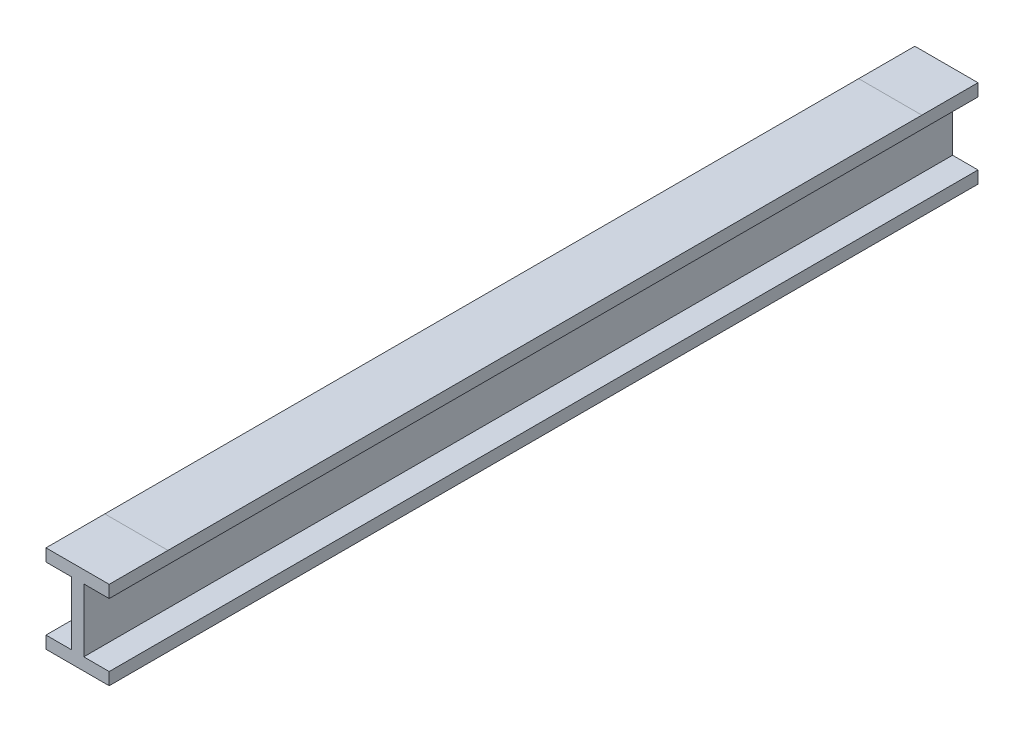
ISO-10303-21;
HEADER;
FILE_DESCRIPTION(('STEP AP214'),'2;1');
FILE_NAME('part.step','',(''),(''),'','','');
FILE_SCHEMA(('AUTOMOTIVE_DESIGN { 1 0 10303 214 1 1 1 1 }'));
ENDSEC;
DATA;
#1=APPLICATION_CONTEXT('core data for automotive mechanical design processes');
#2=APPLICATION_PROTOCOL_DEFINITION('international standard','automotive_design',2000,#1);
#3=PRODUCT_CONTEXT('',#1,'mechanical');
#4=PRODUCT('Part','Part','',(#3));
#5=PRODUCT_RELATED_PRODUCT_CATEGORY('part','',(#4));
#6=PRODUCT_DEFINITION_FORMATION('','',#4);
#7=PRODUCT_DEFINITION_CONTEXT('part definition',#1,'design');
#8=PRODUCT_DEFINITION('design','',#6,#7);
#9=PRODUCT_DEFINITION_SHAPE('','',#8);
#10=(LENGTH_UNIT() NAMED_UNIT(*) SI_UNIT(.MILLI.,.METRE.));
#11=(NAMED_UNIT(*) PLANE_ANGLE_UNIT() SI_UNIT($,.RADIAN.));
#12=(NAMED_UNIT(*) SI_UNIT($,.STERADIAN.) SOLID_ANGLE_UNIT());
#13=UNCERTAINTY_MEASURE_WITH_UNIT(LENGTH_MEASURE(1.E-05),#10,'distance_accuracy_value','');
#14=(GEOMETRIC_REPRESENTATION_CONTEXT(3) GLOBAL_UNCERTAINTY_ASSIGNED_CONTEXT((#13)) GLOBAL_UNIT_ASSIGNED_CONTEXT((#10,
#11,#12)) REPRESENTATION_CONTEXT('',''));
#15=CARTESIAN_POINT('',(0.,0.,0.));
#16=DIRECTION('',(0.,0.,1.));
#17=DIRECTION('',(1.,0.,0.));
#18=AXIS2_PLACEMENT_3D('',#15,#16,#17);
#19=CARTESIAN_POINT('',(0.,0.,2200.));
#20=DIRECTION('',(0.,1.,0.));
#21=DIRECTION('',(0.,0.,1.));
#22=AXIS2_PLACEMENT_3D('',#19,#20,#21);
#23=PLANE('',#22);
#24=DIRECTION('',(-1.,0.,0.));
#25=VECTOR('',#24,1.);
#26=CARTESIAN_POINT('',(0.,0.,2051.13933299652));
#27=LINE('',#26,#25);
#28=CARTESIAN_POINT('',(160.,0.,2051.13933299652));
#29=VERTEX_POINT('',#28);
#30=CARTESIAN_POINT('',(0.,0.,2051.13933299652));
#31=VERTEX_POINT('',#30);
#32=EDGE_CURVE('E12',#29,#31,#27,.T.);
#33=ORIENTED_EDGE('',*,*,#32,.F.);
#34=DIRECTION('',(0.,0.,-1.));
#35=VECTOR('',#34,1.);
#36=CARTESIAN_POINT('',(160.,0.,2200.));
#37=LINE('',#36,#35);
#38=CARTESIAN_POINT('',(160.,0.,2200.));
#39=VERTEX_POINT('',#38);
#40=EDGE_CURVE('E165',#39,#29,#37,.T.);
#41=ORIENTED_EDGE('',*,*,#40,.F.);
#42=DIRECTION('',(1.,0.,0.));
#43=VECTOR('',#42,1.);
#44=CARTESIAN_POINT('',(0.,0.,2200.));
#45=LINE('',#44,#43);
#46=CARTESIAN_POINT('',(0.,0.,2200.));
#47=VERTEX_POINT('',#46);
#48=EDGE_CURVE('E160',#47,#39,#45,.T.);
#49=ORIENTED_EDGE('',*,*,#48,.F.);
#50=DIRECTION('',(0.,0.,-1.));
#51=VECTOR('',#50,1.);
#52=CARTESIAN_POINT('',(0.,0.,2200.));
#53=LINE('',#52,#51);
#54=EDGE_CURVE('E163',#47,#31,#53,.T.);
#55=ORIENTED_EDGE('',*,*,#54,.T.);
#56=EDGE_LOOP('',(#33,#41,#49,#55));
#57=FACE_BOUND('',#56,.T.);
#58=ADVANCED_FACE('F52',(#57),#23,.F.);
#59=CARTESIAN_POINT('',(160.,222.5,2200.));
#60=DIRECTION('',(0.,-1.,0.));
#61=DIRECTION('',(1.,0.,0.));
#62=AXIS2_PLACEMENT_3D('',#59,#60,#61);
#63=PLANE('',#62);
#64=DIRECTION('',(1.,0.,0.));
#65=VECTOR('',#64,1.);
#66=CARTESIAN_POINT('',(160.,222.5,2051.13933299652));
#67=LINE('',#66,#65);
#68=CARTESIAN_POINT('',(0.,222.5,2051.13933299652));
#69=VERTEX_POINT('',#68);
#70=CARTESIAN_POINT('',(160.,222.5,2051.13933299652));
#71=VERTEX_POINT('',#70);
#72=EDGE_CURVE('E56',#69,#71,#67,.T.);
#73=ORIENTED_EDGE('',*,*,#72,.F.);
#74=DIRECTION('',(0.,0.,-1.));
#75=VECTOR('',#74,1.);
#76=CARTESIAN_POINT('',(0.,222.5,2200.));
#77=LINE('',#76,#75);
#78=CARTESIAN_POINT('',(0.,222.5,2200.));
#79=VERTEX_POINT('',#78);
#80=EDGE_CURVE('E222',#79,#69,#77,.T.);
#81=ORIENTED_EDGE('',*,*,#80,.F.);
#82=DIRECTION('',(-1.,0.,0.));
#83=VECTOR('',#82,1.);
#84=CARTESIAN_POINT('',(160.,222.5,2200.));
#85=LINE('',#84,#83);
#86=CARTESIAN_POINT('',(160.,222.5,2200.));
#87=VERTEX_POINT('',#86);
#88=EDGE_CURVE('E271',#87,#79,#85,.T.);
#89=ORIENTED_EDGE('',*,*,#88,.F.);
#90=DIRECTION('',(0.,0.,-1.));
#91=VECTOR('',#90,1.);
#92=CARTESIAN_POINT('',(160.,222.5,2200.));
#93=LINE('',#92,#91);
#94=EDGE_CURVE('E217',#87,#71,#93,.T.);
#95=ORIENTED_EDGE('',*,*,#94,.T.);
#96=EDGE_LOOP('',(#73,#81,#89,#95));
#97=FACE_BOUND('',#96,.T.);
#98=ADVANCED_FACE('F305',(#97),#63,.F.);
#99=CARTESIAN_POINT('',(160.,0.,142.197694443086));
#100=VERTEX_POINT('',#99);
#101=EDGE_CURVE('E196',#29,#100,#37,.T.);
#102=ORIENTED_EDGE('',*,*,#101,.F.);
#103=ORIENTED_EDGE('',*,*,#32,.T.);
#104=CARTESIAN_POINT('',(0.,0.,142.197694443086));
#105=VERTEX_POINT('',#104);
#106=EDGE_CURVE('E182',#31,#105,#53,.T.);
#107=ORIENTED_EDGE('',*,*,#106,.T.);
#108=DIRECTION('',(-1.,0.,0.));
#109=VECTOR('',#108,1.);
#110=CARTESIAN_POINT('',(0.,0.,142.197694443086));
#111=LINE('',#110,#109);
#112=EDGE_CURVE('E188',#100,#105,#111,.T.);
#113=ORIENTED_EDGE('',*,*,#112,.F.);
#114=EDGE_LOOP('',(#102,#103,#107,#113));
#115=FACE_BOUND('',#114,.T.);
#116=ADVANCED_FACE('F354',(#115),#23,.F.);
#117=CARTESIAN_POINT('',(0.,222.5,142.197694443086));
#118=VERTEX_POINT('',#117);
#119=EDGE_CURVE('E225',#69,#118,#77,.T.);
#120=ORIENTED_EDGE('',*,*,#119,.F.);
#121=ORIENTED_EDGE('',*,*,#72,.T.);
#122=CARTESIAN_POINT('',(160.,222.5,142.197694443086));
#123=VERTEX_POINT('',#122);
#124=EDGE_CURVE('E220',#71,#123,#93,.T.);
#125=ORIENTED_EDGE('',*,*,#124,.T.);
#126=DIRECTION('',(1.,0.,0.));
#127=VECTOR('',#126,1.);
#128=CARTESIAN_POINT('',(160.,222.5,142.197694443086));
#129=LINE('',#128,#127);
#130=EDGE_CURVE('E183',#118,#123,#129,.T.);
#131=ORIENTED_EDGE('',*,*,#130,.F.);
#132=EDGE_LOOP('',(#120,#121,#125,#131));
#133=FACE_BOUND('',#132,.T.);
#134=ADVANCED_FACE('F339',(#133),#63,.F.);
#135=CARTESIAN_POINT('',(0.,31.25,2200.));
#136=DIRECTION('',(1.,0.,0.));
#137=DIRECTION('',(0.,0.,-1.));
#138=AXIS2_PLACEMENT_3D('',#135,#136,#137);
#139=PLANE('',#138);
#140=DIRECTION('',(0.,-1.,0.));
#141=VECTOR('',#140,1.);
#142=CARTESIAN_POINT('',(0.,31.25,0.));
#143=LINE('',#142,#141);
#144=CARTESIAN_POINT('',(0.,31.25,0.));
#145=VERTEX_POINT('',#144);
#146=CARTESIAN_POINT('',(0.,0.,0.));
#147=VERTEX_POINT('',#146);
#148=EDGE_CURVE('E262',#145,#147,#143,.T.);
#149=ORIENTED_EDGE('',*,*,#148,.T.);
#150=EDGE_CURVE('E185',#105,#147,#53,.T.);
#151=ORIENTED_EDGE('',*,*,#150,.F.);
#152=ORIENTED_EDGE('',*,*,#106,.F.);
#153=ORIENTED_EDGE('',*,*,#54,.F.);
#154=DIRECTION('',(0.,-1.,0.));
#155=VECTOR('',#154,1.);
#156=CARTESIAN_POINT('',(0.,31.25,2200.));
#157=LINE('',#156,#155);
#158=CARTESIAN_POINT('',(0.,31.25,2200.));
#159=VERTEX_POINT('',#158);
#160=EDGE_CURVE('E169',#159,#47,#157,.T.);
#161=ORIENTED_EDGE('',*,*,#160,.F.);
#162=DIRECTION('',(0.,0.,-1.));
#163=VECTOR('',#162,1.);
#164=CARTESIAN_POINT('',(0.,31.25,2200.));
#165=LINE('',#164,#163);
#166=EDGE_CURVE('E236',#159,#145,#165,.T.);
#167=ORIENTED_EDGE('',*,*,#166,.T.);
#168=EDGE_LOOP('',(#149,#151,#152,#153,#161,#167));
#169=FACE_BOUND('',#168,.T.);
#170=ADVANCED_FACE('F54',(#169),#139,.F.);
#171=CARTESIAN_POINT('',(160.,0.,0.));
#172=VERTEX_POINT('',#171);
#173=EDGE_CURVE('E197',#100,#172,#37,.T.);
#174=ORIENTED_EDGE('',*,*,#173,.F.);
#175=ORIENTED_EDGE('',*,*,#112,.T.);
#176=ORIENTED_EDGE('',*,*,#150,.T.);
#177=DIRECTION('',(1.,0.,0.));
#178=VECTOR('',#177,1.);
#179=CARTESIAN_POINT('',(0.,0.,0.));
#180=LINE('',#179,#178);
#181=EDGE_CURVE('E260',#147,#172,#180,.T.);
#182=ORIENTED_EDGE('',*,*,#181,.T.);
#183=EDGE_LOOP('',(#174,#175,#176,#182));
#184=FACE_BOUND('',#183,.T.);
#185=ADVANCED_FACE('F327',(#184),#23,.F.);
#186=CARTESIAN_POINT('',(160.,0.,2200.));
#187=DIRECTION('',(-1.,0.,0.));
#188=DIRECTION('',(0.,0.,1.));
#189=AXIS2_PLACEMENT_3D('',#186,#187,#188);
#190=PLANE('',#189);
#191=DIRECTION('',(0.,1.,0.));
#192=VECTOR('',#191,1.);
#193=CARTESIAN_POINT('',(160.,0.,0.));
#194=LINE('',#193,#192);
#195=CARTESIAN_POINT('',(160.,31.25,0.));
#196=VERTEX_POINT('',#195);
#197=EDGE_CURVE('E258',#172,#196,#194,.T.);
#198=ORIENTED_EDGE('',*,*,#197,.T.);
#199=DIRECTION('',(0.,0.,-1.));
#200=VECTOR('',#199,1.);
#201=CARTESIAN_POINT('',(160.,31.25,2200.));
#202=LINE('',#201,#200);
#203=CARTESIAN_POINT('',(160.,31.25,2200.));
#204=VERTEX_POINT('',#203);
#205=EDGE_CURVE('E200',#204,#196,#202,.T.);
#206=ORIENTED_EDGE('',*,*,#205,.F.);
#207=DIRECTION('',(0.,1.,0.));
#208=VECTOR('',#207,1.);
#209=CARTESIAN_POINT('',(160.,0.,2200.));
#210=LINE('',#209,#208);
#211=EDGE_CURVE('E168',#39,#204,#210,.T.);
#212=ORIENTED_EDGE('',*,*,#211,.F.);
#213=ORIENTED_EDGE('',*,*,#40,.T.);
#214=ORIENTED_EDGE('',*,*,#101,.T.);
#215=ORIENTED_EDGE('',*,*,#173,.T.);
#216=EDGE_LOOP('',(#198,#206,#212,#213,#214,#215));
#217=FACE_BOUND('',#216,.T.);
#218=ADVANCED_FACE('F282',(#217),#190,.F.);
#219=CARTESIAN_POINT('',(160.,31.25,2200.));
#220=DIRECTION('',(0.,-1.,0.));
#221=DIRECTION('',(0.,0.,-1.));
#222=AXIS2_PLACEMENT_3D('',#219,#220,#221);
#223=PLANE('',#222);
#224=DIRECTION('',(-1.,0.,0.));
#225=VECTOR('',#224,1.);
#226=CARTESIAN_POINT('',(160.,31.25,0.));
#227=LINE('',#226,#225);
#228=CARTESIAN_POINT('',(95.625,31.25,0.));
#229=VERTEX_POINT('',#228);
#230=EDGE_CURVE('E256',#196,#229,#227,.T.);
#231=ORIENTED_EDGE('',*,*,#230,.T.);
#232=DIRECTION('',(0.,0.,-1.));
#233=VECTOR('',#232,1.);
#234=CARTESIAN_POINT('',(95.625,31.25,2200.));
#235=LINE('',#234,#233);
#236=CARTESIAN_POINT('',(95.625,31.25,2200.));
#237=VERTEX_POINT('',#236);
#238=EDGE_CURVE('E203',#237,#229,#235,.T.);
#239=ORIENTED_EDGE('',*,*,#238,.F.);
#240=DIRECTION('',(-1.,0.,0.));
#241=VECTOR('',#240,1.);
#242=CARTESIAN_POINT('',(160.,31.25,2200.));
#243=LINE('',#242,#241);
#244=EDGE_CURVE('E279',#204,#237,#243,.T.);
#245=ORIENTED_EDGE('',*,*,#244,.F.);
#246=ORIENTED_EDGE('',*,*,#205,.T.);
#247=EDGE_LOOP('',(#231,#239,#245,#246));
#248=FACE_BOUND('',#247,.T.);
#249=ADVANCED_FACE('F284',(#248),#223,.F.);
#250=CARTESIAN_POINT('',(95.625,31.25,2200.));
#251=DIRECTION('',(-1.,0.,0.));
#252=DIRECTION('',(0.,0.,1.));
#253=AXIS2_PLACEMENT_3D('',#250,#251,#252);
#254=PLANE('',#253);
#255=DIRECTION('',(0.,1.,0.));
#256=VECTOR('',#255,1.);
#257=CARTESIAN_POINT('',(95.625,31.25,0.));
#258=LINE('',#257,#256);
#259=CARTESIAN_POINT('',(95.625,191.25,0.));
#260=VERTEX_POINT('',#259);
#261=EDGE_CURVE('E252',#229,#260,#258,.T.);
#262=ORIENTED_EDGE('',*,*,#261,.T.);
#263=DIRECTION('',(0.,0.,-1.));
#264=VECTOR('',#263,1.);
#265=CARTESIAN_POINT('',(95.625,191.25,2200.));
#266=LINE('',#265,#264);
#267=CARTESIAN_POINT('',(95.625,191.25,2200.));
#268=VERTEX_POINT('',#267);
#269=EDGE_CURVE('E209',#268,#260,#266,.T.);
#270=ORIENTED_EDGE('',*,*,#269,.F.);
#271=DIRECTION('',(0.,1.,0.));
#272=VECTOR('',#271,1.);
#273=CARTESIAN_POINT('',(95.625,31.25,2200.));
#274=LINE('',#273,#272);
#275=EDGE_CURVE('E277',#237,#268,#274,.T.);
#276=ORIENTED_EDGE('',*,*,#275,.F.);
#277=ORIENTED_EDGE('',*,*,#238,.T.);
#278=EDGE_LOOP('',(#262,#270,#276,#277));
#279=FACE_BOUND('',#278,.T.);
#280=ADVANCED_FACE('F289',(#279),#254,.F.);
#281=CARTESIAN_POINT('',(95.625,191.25,2200.));
#282=DIRECTION('',(0.,1.,0.));
#283=DIRECTION('',(0.,0.,1.));
#284=AXIS2_PLACEMENT_3D('',#281,#282,#283);
#285=PLANE('',#284);
#286=DIRECTION('',(1.,0.,0.));
#287=VECTOR('',#286,1.);
#288=CARTESIAN_POINT('',(95.625,191.25,0.));
#289=LINE('',#288,#287);
#290=CARTESIAN_POINT('',(160.,191.25,0.));
#291=VERTEX_POINT('',#290);
#292=EDGE_CURVE('E251',#260,#291,#289,.T.);
#293=ORIENTED_EDGE('',*,*,#292,.T.);
#294=DIRECTION('',(0.,0.,-1.));
#295=VECTOR('',#294,1.);
#296=CARTESIAN_POINT('',(160.,191.25,2200.));
#297=LINE('',#296,#295);
#298=CARTESIAN_POINT('',(160.,191.25,2200.));
#299=VERTEX_POINT('',#298);
#300=EDGE_CURVE('E214',#299,#291,#297,.T.);
#301=ORIENTED_EDGE('',*,*,#300,.F.);
#302=DIRECTION('',(1.,0.,0.));
#303=VECTOR('',#302,1.);
#304=CARTESIAN_POINT('',(95.625,191.25,2200.));
#305=LINE('',#304,#303);
#306=EDGE_CURVE('E275',#268,#299,#305,.T.);
#307=ORIENTED_EDGE('',*,*,#306,.F.);
#308=ORIENTED_EDGE('',*,*,#269,.T.);
#309=EDGE_LOOP('',(#293,#301,#307,#308));
#310=FACE_BOUND('',#309,.T.);
#311=ADVANCED_FACE('F295',(#310),#285,.F.);
#312=CARTESIAN_POINT('',(160.,191.25,2200.));
#313=DIRECTION('',(-1.,0.,0.));
#314=DIRECTION('',(0.,0.,1.));
#315=AXIS2_PLACEMENT_3D('',#312,#313,#314);
#316=PLANE('',#315);
#317=DIRECTION('',(0.,1.,0.));
#318=VECTOR('',#317,1.);
#319=CARTESIAN_POINT('',(160.,191.25,0.));
#320=LINE('',#319,#318);
#321=CARTESIAN_POINT('',(160.,222.5,0.));
#322=VERTEX_POINT('',#321);
#323=EDGE_CURVE('E248',#291,#322,#320,.T.);
#324=ORIENTED_EDGE('',*,*,#323,.T.);
#325=EDGE_CURVE('E221',#123,#322,#93,.T.);
#326=ORIENTED_EDGE('',*,*,#325,.F.);
#327=ORIENTED_EDGE('',*,*,#124,.F.);
#328=ORIENTED_EDGE('',*,*,#94,.F.);
#329=DIRECTION('',(0.,1.,0.));
#330=VECTOR('',#329,1.);
#331=CARTESIAN_POINT('',(160.,191.25,2200.));
#332=LINE('',#331,#330);
#333=EDGE_CURVE('E273',#299,#87,#332,.T.);
#334=ORIENTED_EDGE('',*,*,#333,.F.);
#335=ORIENTED_EDGE('',*,*,#300,.T.);
#336=EDGE_LOOP('',(#324,#326,#327,#328,#334,#335));
#337=FACE_BOUND('',#336,.T.);
#338=ADVANCED_FACE('F299',(#337),#316,.F.);
#339=CARTESIAN_POINT('',(0.,222.5,0.));
#340=VERTEX_POINT('',#339);
#341=EDGE_CURVE('E226',#118,#340,#77,.T.);
#342=ORIENTED_EDGE('',*,*,#341,.F.);
#343=ORIENTED_EDGE('',*,*,#130,.T.);
#344=ORIENTED_EDGE('',*,*,#325,.T.);
#345=DIRECTION('',(-1.,0.,0.));
#346=VECTOR('',#345,1.);
#347=CARTESIAN_POINT('',(160.,222.5,0.));
#348=LINE('',#347,#346);
#349=EDGE_CURVE('E245',#322,#340,#348,.T.);
#350=ORIENTED_EDGE('',*,*,#349,.T.);
#351=EDGE_LOOP('',(#342,#343,#344,#350));
#352=FACE_BOUND('',#351,.T.);
#353=ADVANCED_FACE('F344',(#352),#63,.F.);
#354=CARTESIAN_POINT('',(0.,222.5,2200.));
#355=DIRECTION('',(1.,0.,0.));
#356=DIRECTION('',(0.,1.,0.));
#357=AXIS2_PLACEMENT_3D('',#354,#355,#356);
#358=PLANE('',#357);
#359=DIRECTION('',(0.,-1.,0.));
#360=VECTOR('',#359,1.);
#361=CARTESIAN_POINT('',(0.,222.5,0.));
#362=LINE('',#361,#360);
#363=CARTESIAN_POINT('',(0.,191.25,0.));
#364=VERTEX_POINT('',#363);
#365=EDGE_CURVE('E243',#340,#364,#362,.T.);
#366=ORIENTED_EDGE('',*,*,#365,.T.);
#367=DIRECTION('',(0.,0.,-1.));
#368=VECTOR('',#367,1.);
#369=CARTESIAN_POINT('',(0.,191.25,2200.));
#370=LINE('',#369,#368);
#371=CARTESIAN_POINT('',(0.,191.25,2200.));
#372=VERTEX_POINT('',#371);
#373=EDGE_CURVE('E227',#372,#364,#370,.T.);
#374=ORIENTED_EDGE('',*,*,#373,.F.);
#375=DIRECTION('',(0.,-1.,0.));
#376=VECTOR('',#375,1.);
#377=CARTESIAN_POINT('',(0.,222.5,2200.));
#378=LINE('',#377,#376);
#379=EDGE_CURVE('E269',#79,#372,#378,.T.);
#380=ORIENTED_EDGE('',*,*,#379,.F.);
#381=ORIENTED_EDGE('',*,*,#80,.T.);
#382=ORIENTED_EDGE('',*,*,#119,.T.);
#383=ORIENTED_EDGE('',*,*,#341,.T.);
#384=EDGE_LOOP('',(#366,#374,#380,#381,#382,#383));
#385=FACE_BOUND('',#384,.T.);
#386=ADVANCED_FACE('F311',(#385),#358,.F.);
#387=CARTESIAN_POINT('',(0.,191.25,2200.));
#388=DIRECTION('',(0.,1.,0.));
#389=DIRECTION('',(0.,0.,1.));
#390=AXIS2_PLACEMENT_3D('',#387,#388,#389);
#391=PLANE('',#390);
#392=DIRECTION('',(1.,0.,0.));
#393=VECTOR('',#392,1.);
#394=CARTESIAN_POINT('',(0.,191.25,0.));
#395=LINE('',#394,#393);
#396=CARTESIAN_POINT('',(64.375,191.25,0.));
#397=VERTEX_POINT('',#396);
#398=EDGE_CURVE('E241',#364,#397,#395,.T.);
#399=ORIENTED_EDGE('',*,*,#398,.T.);
#400=DIRECTION('',(0.,0.,-1.));
#401=VECTOR('',#400,1.);
#402=CARTESIAN_POINT('',(64.375,191.25,2200.));
#403=LINE('',#402,#401);
#404=CARTESIAN_POINT('',(64.375,191.25,2200.));
#405=VERTEX_POINT('',#404);
#406=EDGE_CURVE('E230',#405,#397,#403,.T.);
#407=ORIENTED_EDGE('',*,*,#406,.F.);
#408=DIRECTION('',(1.,0.,0.));
#409=VECTOR('',#408,1.);
#410=CARTESIAN_POINT('',(0.,191.25,2200.));
#411=LINE('',#410,#409);
#412=EDGE_CURVE('E267',#372,#405,#411,.T.);
#413=ORIENTED_EDGE('',*,*,#412,.F.);
#414=ORIENTED_EDGE('',*,*,#373,.T.);
#415=EDGE_LOOP('',(#399,#407,#413,#414));
#416=FACE_BOUND('',#415,.T.);
#417=ADVANCED_FACE('F315',(#416),#391,.F.);
#418=CARTESIAN_POINT('',(64.375,191.25,2200.));
#419=DIRECTION('',(1.,0.,0.));
#420=DIRECTION('',(0.,0.,-1.));
#421=AXIS2_PLACEMENT_3D('',#418,#419,#420);
#422=PLANE('',#421);
#423=DIRECTION('',(0.,-1.,0.));
#424=VECTOR('',#423,1.);
#425=CARTESIAN_POINT('',(64.375,191.25,0.));
#426=LINE('',#425,#424);
#427=CARTESIAN_POINT('',(64.375,31.25,0.));
#428=VERTEX_POINT('',#427);
#429=EDGE_CURVE('E239',#397,#428,#426,.T.);
#430=ORIENTED_EDGE('',*,*,#429,.T.);
#431=DIRECTION('',(0.,0.,-1.));
#432=VECTOR('',#431,1.);
#433=CARTESIAN_POINT('',(64.375,31.25,2200.));
#434=LINE('',#433,#432);
#435=CARTESIAN_POINT('',(64.375,31.25,2200.));
#436=VERTEX_POINT('',#435);
#437=EDGE_CURVE('E233',#436,#428,#434,.T.);
#438=ORIENTED_EDGE('',*,*,#437,.F.);
#439=DIRECTION('',(0.,-1.,0.));
#440=VECTOR('',#439,1.);
#441=CARTESIAN_POINT('',(64.375,191.25,2200.));
#442=LINE('',#441,#440);
#443=EDGE_CURVE('E265',#405,#436,#442,.T.);
#444=ORIENTED_EDGE('',*,*,#443,.F.);
#445=ORIENTED_EDGE('',*,*,#406,.T.);
#446=EDGE_LOOP('',(#430,#438,#444,#445));
#447=FACE_BOUND('',#446,.T.);
#448=ADVANCED_FACE('F320',(#447),#422,.F.);
#449=CARTESIAN_POINT('',(64.375,31.25,2200.));
#450=DIRECTION('',(0.,-1.,0.));
#451=DIRECTION('',(0.,0.,-1.));
#452=AXIS2_PLACEMENT_3D('',#449,#450,#451);
#453=PLANE('',#452);
#454=DIRECTION('',(-1.,0.,0.));
#455=VECTOR('',#454,1.);
#456=CARTESIAN_POINT('',(64.375,31.25,0.));
#457=LINE('',#456,#455);
#458=EDGE_CURVE('E178',#428,#145,#457,.T.);
#459=ORIENTED_EDGE('',*,*,#458,.T.);
#460=ORIENTED_EDGE('',*,*,#166,.F.);
#461=DIRECTION('',(-1.,0.,0.));
#462=VECTOR('',#461,1.);
#463=CARTESIAN_POINT('',(64.375,31.25,2200.));
#464=LINE('',#463,#462);
#465=EDGE_CURVE('E174',#436,#159,#464,.T.);
#466=ORIENTED_EDGE('',*,*,#465,.F.);
#467=ORIENTED_EDGE('',*,*,#437,.T.);
#468=EDGE_LOOP('',(#459,#460,#466,#467));
#469=FACE_BOUND('',#468,.T.);
#470=ADVANCED_FACE('F323',(#469),#453,.F.);
#471=CARTESIAN_POINT('',(0.,0.,2200.));
#472=DIRECTION('',(0.,0.,1.));
#473=DIRECTION('',(1.,0.,0.));
#474=AXIS2_PLACEMENT_3D('',#471,#472,#473);
#475=PLANE('',#474);
#476=ORIENTED_EDGE('',*,*,#160,.T.);
#477=ORIENTED_EDGE('',*,*,#48,.T.);
#478=ORIENTED_EDGE('',*,*,#211,.T.);
#479=ORIENTED_EDGE('',*,*,#244,.T.);
#480=ORIENTED_EDGE('',*,*,#275,.T.);
#481=ORIENTED_EDGE('',*,*,#306,.T.);
#482=ORIENTED_EDGE('',*,*,#333,.T.);
#483=ORIENTED_EDGE('',*,*,#88,.T.);
#484=ORIENTED_EDGE('',*,*,#379,.T.);
#485=ORIENTED_EDGE('',*,*,#412,.T.);
#486=ORIENTED_EDGE('',*,*,#443,.T.);
#487=ORIENTED_EDGE('',*,*,#465,.T.);
#488=EDGE_LOOP('',(#476,#477,#478,#479,#480,#481,#482,#483,#484,#485,#486,#487));
#489=FACE_BOUND('',#488,.T.);
#490=ADVANCED_FACE('F172',(#489),#475,.T.);
#491=CARTESIAN_POINT('',(0.,0.,0.));
#492=DIRECTION('',(0.,0.,1.));
#493=DIRECTION('',(1.,0.,0.));
#494=AXIS2_PLACEMENT_3D('',#491,#492,#493);
#495=PLANE('',#494);
#496=ORIENTED_EDGE('',*,*,#148,.F.);
#497=ORIENTED_EDGE('',*,*,#458,.F.);
#498=ORIENTED_EDGE('',*,*,#429,.F.);
#499=ORIENTED_EDGE('',*,*,#398,.F.);
#500=ORIENTED_EDGE('',*,*,#365,.F.);
#501=ORIENTED_EDGE('',*,*,#349,.F.);
#502=ORIENTED_EDGE('',*,*,#323,.F.);
#503=ORIENTED_EDGE('',*,*,#292,.F.);
#504=ORIENTED_EDGE('',*,*,#261,.F.);
#505=ORIENTED_EDGE('',*,*,#230,.F.);
#506=ORIENTED_EDGE('',*,*,#197,.F.);
#507=ORIENTED_EDGE('',*,*,#181,.F.);
#508=EDGE_LOOP('',(#496,#497,#498,#499,#500,#501,#502,#503,#504,#505,#506,#507));
#509=FACE_BOUND('',#508,.T.);
#510=ADVANCED_FACE('F326',(#509),#495,.F.);
#511=CLOSED_SHELL('',(#58,#98,#116,#134,#170,#185,#218,#249,#280,#311,#338,#353,#386,#417,#448,
#470,#490,#510));
#512=MANIFOLD_SOLID_BREP('B2',#511);
#513=ADVANCED_BREP_SHAPE_REPRESENTATION('',(#18,#512),#14);
#514=SHAPE_DEFINITION_REPRESENTATION(#9,#513);
ENDSEC;
END-ISO-10303-21;
